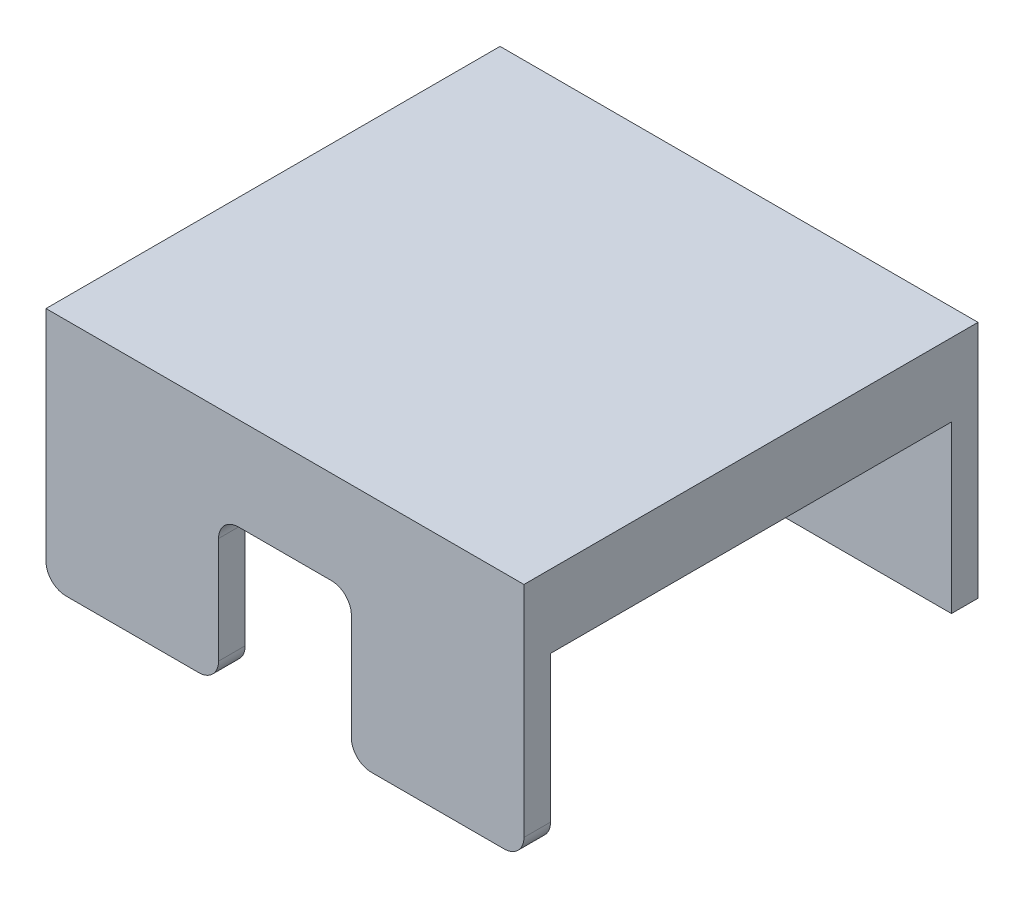
ISO-10303-21;
HEADER;
FILE_DESCRIPTION(('STEP AP214'),'2;1');
FILE_NAME('part.step','',(''),(''),'','','');
FILE_SCHEMA(('AUTOMOTIVE_DESIGN { 1 0 10303 214 1 1 1 1 }'));
ENDSEC;
DATA;
#1=APPLICATION_CONTEXT('core data for automotive mechanical design processes');
#2=APPLICATION_PROTOCOL_DEFINITION('international standard','automotive_design',2000,#1);
#3=PRODUCT_CONTEXT('',#1,'mechanical');
#4=PRODUCT('Part','Part','',(#3));
#5=PRODUCT_RELATED_PRODUCT_CATEGORY('part','',(#4));
#6=PRODUCT_DEFINITION_FORMATION('','',#4);
#7=PRODUCT_DEFINITION_CONTEXT('part definition',#1,'design');
#8=PRODUCT_DEFINITION('design','',#6,#7);
#9=PRODUCT_DEFINITION_SHAPE('','',#8);
#10=(LENGTH_UNIT() NAMED_UNIT(*) SI_UNIT(.MILLI.,.METRE.));
#11=(NAMED_UNIT(*) PLANE_ANGLE_UNIT() SI_UNIT($,.RADIAN.));
#12=(NAMED_UNIT(*) SI_UNIT($,.STERADIAN.) SOLID_ANGLE_UNIT());
#13=UNCERTAINTY_MEASURE_WITH_UNIT(LENGTH_MEASURE(1.E-05),#10,'distance_accuracy_value','');
#14=(GEOMETRIC_REPRESENTATION_CONTEXT(3) GLOBAL_UNCERTAINTY_ASSIGNED_CONTEXT((#13)) GLOBAL_UNIT_ASSIGNED_CONTEXT((#10,
#11,#12)) REPRESENTATION_CONTEXT('',''));
#15=CARTESIAN_POINT('',(0.,0.,0.));
#16=DIRECTION('',(0.,0.,1.));
#17=DIRECTION('',(1.,0.,0.));
#18=AXIS2_PLACEMENT_3D('',#15,#16,#17);
#19=CARTESIAN_POINT('',(0.,0.,0.));
#20=DIRECTION('',(0.,1.,0.));
#21=DIRECTION('',(0.,0.,1.));
#22=AXIS2_PLACEMENT_3D('',#19,#20,#21);
#23=PLANE('',#22);
#24=DIRECTION('',(1.,0.,0.));
#25=VECTOR('',#24,1.);
#26=CARTESIAN_POINT('',(0.,0.,-151.));
#27=LINE('',#26,#25);
#28=CARTESIAN_POINT('',(-180.,0.,-151.));
#29=VERTEX_POINT('',#28);
#30=CARTESIAN_POINT('',(180.,0.,-151.));
#31=VERTEX_POINT('',#30);
#32=EDGE_CURVE('E54',#29,#31,#27,.T.);
#33=ORIENTED_EDGE('',*,*,#32,.T.);
#34=DIRECTION('',(0.,0.,-1.));
#35=VECTOR('',#34,1.);
#36=CARTESIAN_POINT('',(180.,0.,-171.));
#37=LINE('',#36,#35);
#38=CARTESIAN_POINT('',(180.,0.,151.));
#39=VERTEX_POINT('',#38);
#40=EDGE_CURVE('E199',#39,#31,#37,.T.);
#41=ORIENTED_EDGE('',*,*,#40,.F.);
#42=DIRECTION('',(1.,0.,0.));
#43=VECTOR('',#42,1.);
#44=CARTESIAN_POINT('',(0.,0.,151.));
#45=LINE('',#44,#43);
#46=CARTESIAN_POINT('',(-180.,0.,151.));
#47=VERTEX_POINT('',#46);
#48=EDGE_CURVE('E324',#47,#39,#45,.T.);
#49=ORIENTED_EDGE('',*,*,#48,.F.);
#50=DIRECTION('',(0.,0.,1.));
#51=VECTOR('',#50,1.);
#52=CARTESIAN_POINT('',(-180.,0.,-171.));
#53=LINE('',#52,#51);
#54=EDGE_CURVE('E201',#29,#47,#53,.T.);
#55=ORIENTED_EDGE('',*,*,#54,.F.);
#56=EDGE_LOOP('',(#33,#41,#49,#55));
#57=FACE_BOUND('',#56,.T.);
#58=ADVANCED_FACE('F39',(#57),#23,.F.);
#59=CARTESIAN_POINT('',(180.,55.,-171.));
#60=DIRECTION('',(-1.,0.,0.));
#61=DIRECTION('',(0.,0.,1.));
#62=AXIS2_PLACEMENT_3D('',#59,#60,#61);
#63=PLANE('',#62);
#64=DIRECTION('',(0.,-1.,0.));
#65=VECTOR('',#64,1.);
#66=CARTESIAN_POINT('',(180.,55.,171.));
#67=LINE('',#66,#65);
#68=CARTESIAN_POINT('',(180.,55.,171.));
#69=VERTEX_POINT('',#68);
#70=CARTESIAN_POINT('',(180.,-110.,171.));
#71=VERTEX_POINT('',#70);
#72=EDGE_CURVE('E218',#69,#71,#67,.T.);
#73=ORIENTED_EDGE('',*,*,#72,.T.);
#74=DIRECTION('',(0.,0.,1.));
#75=VECTOR('',#74,1.);
#76=CARTESIAN_POINT('',(180.,-110.,-171.));
#77=LINE('',#76,#75);
#78=CARTESIAN_POINT('',(180.,-110.,151.));
#79=VERTEX_POINT('',#78);
#80=EDGE_CURVE('E270',#71,#79,#77,.F.);
#81=ORIENTED_EDGE('',*,*,#80,.T.);
#82=DIRECTION('',(0.,-1.,0.));
#83=VECTOR('',#82,1.);
#84=CARTESIAN_POINT('',(180.,0.,151.));
#85=LINE('',#84,#83);
#86=EDGE_CURVE('E207',#39,#79,#85,.T.);
#87=ORIENTED_EDGE('',*,*,#86,.F.);
#88=ORIENTED_EDGE('',*,*,#40,.T.);
#89=DIRECTION('',(0.,-1.,0.));
#90=VECTOR('',#89,1.);
#91=CARTESIAN_POINT('',(180.,0.,-151.));
#92=LINE('',#91,#90);
#93=CARTESIAN_POINT('',(180.,-125.,-151.));
#94=VERTEX_POINT('',#93);
#95=EDGE_CURVE('E188',#31,#94,#92,.T.);
#96=ORIENTED_EDGE('',*,*,#95,.T.);
#97=DIRECTION('',(0.,0.,-1.));
#98=VECTOR('',#97,1.);
#99=CARTESIAN_POINT('',(180.,-125.,-151.));
#100=LINE('',#99,#98);
#101=CARTESIAN_POINT('',(180.,-125.,-171.));
#102=VERTEX_POINT('',#101);
#103=EDGE_CURVE('E339',#94,#102,#100,.T.);
#104=ORIENTED_EDGE('',*,*,#103,.T.);
#105=DIRECTION('',(0.,-1.,0.));
#106=VECTOR('',#105,1.);
#107=CARTESIAN_POINT('',(180.,55.,-171.));
#108=LINE('',#107,#106);
#109=CARTESIAN_POINT('',(180.,55.,-171.));
#110=VERTEX_POINT('',#109);
#111=EDGE_CURVE('E225',#110,#102,#108,.T.);
#112=ORIENTED_EDGE('',*,*,#111,.F.);
#113=DIRECTION('',(0.,0.,-1.));
#114=VECTOR('',#113,1.);
#115=CARTESIAN_POINT('',(180.,55.,-171.));
#116=LINE('',#115,#114);
#117=EDGE_CURVE('E210',#69,#110,#116,.T.);
#118=ORIENTED_EDGE('',*,*,#117,.F.);
#119=EDGE_LOOP('',(#73,#81,#87,#88,#96,#104,#112,#118));
#120=FACE_BOUND('',#119,.T.);
#121=ADVANCED_FACE('F205',(#120),#63,.F.);
#122=CARTESIAN_POINT('',(-180.,55.,-171.));
#123=DIRECTION('',(0.,0.,1.));
#124=DIRECTION('',(1.,0.,0.));
#125=AXIS2_PLACEMENT_3D('',#122,#123,#124);
#126=PLANE('',#125);
#127=ORIENTED_EDGE('',*,*,#111,.T.);
#128=DIRECTION('',(-1.,0.,0.));
#129=VECTOR('',#128,1.);
#130=CARTESIAN_POINT('',(0.,-125.,-171.));
#131=LINE('',#130,#129);
#132=CARTESIAN_POINT('',(50.,-125.,-171.));
#133=VERTEX_POINT('',#132);
#134=EDGE_CURVE('E345',#102,#133,#131,.T.);
#135=ORIENTED_EDGE('',*,*,#134,.T.);
#136=DIRECTION('',(0.,-1.,0.));
#137=VECTOR('',#136,1.);
#138=CARTESIAN_POINT('',(50.,0.,-171.));
#139=LINE('',#138,#137);
#140=CARTESIAN_POINT('',(50.,-15.,-171.));
#141=VERTEX_POINT('',#140);
#142=EDGE_CURVE('E399',#141,#133,#139,.T.);
#143=ORIENTED_EDGE('',*,*,#142,.F.);
#144=DIRECTION('',(-1.,0.,0.));
#145=VECTOR('',#144,1.);
#146=CARTESIAN_POINT('',(0.,-15.,-171.));
#147=LINE('',#146,#145);
#148=CARTESIAN_POINT('',(-50.,-15.,-171.));
#149=VERTEX_POINT('',#148);
#150=EDGE_CURVE('E396',#141,#149,#147,.T.);
#151=ORIENTED_EDGE('',*,*,#150,.T.);
#152=DIRECTION('',(0.,-1.,0.));
#153=VECTOR('',#152,1.);
#154=CARTESIAN_POINT('',(-50.,0.,-171.));
#155=LINE('',#154,#153);
#156=CARTESIAN_POINT('',(-50.,-125.,-171.));
#157=VERTEX_POINT('',#156);
#158=EDGE_CURVE('E394',#149,#157,#155,.T.);
#159=ORIENTED_EDGE('',*,*,#158,.T.);
#160=DIRECTION('',(1.,0.,0.));
#161=VECTOR('',#160,1.);
#162=CARTESIAN_POINT('',(0.,-125.,-171.));
#163=LINE('',#162,#161);
#164=CARTESIAN_POINT('',(-180.,-125.,-171.));
#165=VERTEX_POINT('',#164);
#166=EDGE_CURVE('E202',#165,#157,#163,.T.);
#167=ORIENTED_EDGE('',*,*,#166,.F.);
#168=DIRECTION('',(0.,-1.,0.));
#169=VECTOR('',#168,1.);
#170=CARTESIAN_POINT('',(-180.,55.,-171.));
#171=LINE('',#170,#169);
#172=CARTESIAN_POINT('',(-180.,55.,-171.));
#173=VERTEX_POINT('',#172);
#174=EDGE_CURVE('E223',#173,#165,#171,.T.);
#175=ORIENTED_EDGE('',*,*,#174,.F.);
#176=DIRECTION('',(-1.,0.,0.));
#177=VECTOR('',#176,1.);
#178=CARTESIAN_POINT('',(-180.,55.,-171.));
#179=LINE('',#178,#177);
#180=EDGE_CURVE('E327',#110,#173,#179,.T.);
#181=ORIENTED_EDGE('',*,*,#180,.F.);
#182=EDGE_LOOP('',(#127,#135,#143,#151,#159,#167,#175,#181));
#183=FACE_BOUND('',#182,.T.);
#184=ADVANCED_FACE('F343',(#183),#126,.F.);
#185=CARTESIAN_POINT('',(-180.,55.,-171.));
#186=DIRECTION('',(1.,0.,0.));
#187=DIRECTION('',(0.,0.,-1.));
#188=AXIS2_PLACEMENT_3D('',#185,#186,#187);
#189=PLANE('',#188);
#190=DIRECTION('',(0.,-1.,0.));
#191=VECTOR('',#190,1.);
#192=CARTESIAN_POINT('',(-180.,0.,151.));
#193=LINE('',#192,#191);
#194=CARTESIAN_POINT('',(-180.,-110.,151.));
#195=VERTEX_POINT('',#194);
#196=EDGE_CURVE('E366',#47,#195,#193,.T.);
#197=ORIENTED_EDGE('',*,*,#196,.T.);
#198=DIRECTION('',(0.,0.,1.));
#199=VECTOR('',#198,1.);
#200=CARTESIAN_POINT('',(-180.,-110.,171.));
#201=LINE('',#200,#199);
#202=CARTESIAN_POINT('',(-180.,-110.,171.));
#203=VERTEX_POINT('',#202);
#204=EDGE_CURVE('E242',#195,#203,#201,.T.);
#205=ORIENTED_EDGE('',*,*,#204,.T.);
#206=DIRECTION('',(0.,-1.,0.));
#207=VECTOR('',#206,1.);
#208=CARTESIAN_POINT('',(-180.,55.,171.));
#209=LINE('',#208,#207);
#210=CARTESIAN_POINT('',(-180.,55.,171.));
#211=VERTEX_POINT('',#210);
#212=EDGE_CURVE('E220',#211,#203,#209,.T.);
#213=ORIENTED_EDGE('',*,*,#212,.F.);
#214=DIRECTION('',(0.,0.,1.));
#215=VECTOR('',#214,1.);
#216=CARTESIAN_POINT('',(-180.,55.,-171.));
#217=LINE('',#216,#215);
#218=EDGE_CURVE('E328',#173,#211,#217,.T.);
#219=ORIENTED_EDGE('',*,*,#218,.F.);
#220=ORIENTED_EDGE('',*,*,#174,.T.);
#221=DIRECTION('',(0.,0.,-1.));
#222=VECTOR('',#221,1.);
#223=CARTESIAN_POINT('',(-180.,-125.,-151.));
#224=LINE('',#223,#222);
#225=CARTESIAN_POINT('',(-180.,-125.,-151.));
#226=VERTEX_POINT('',#225);
#227=EDGE_CURVE('E374',#226,#165,#224,.T.);
#228=ORIENTED_EDGE('',*,*,#227,.F.);
#229=DIRECTION('',(0.,-1.,0.));
#230=VECTOR('',#229,1.);
#231=CARTESIAN_POINT('',(-180.,0.,-151.));
#232=LINE('',#231,#230);
#233=EDGE_CURVE('E384',#29,#226,#232,.T.);
#234=ORIENTED_EDGE('',*,*,#233,.F.);
#235=ORIENTED_EDGE('',*,*,#54,.T.);
#236=EDGE_LOOP('',(#197,#205,#213,#219,#220,#228,#234,#235));
#237=FACE_BOUND('',#236,.T.);
#238=ADVANCED_FACE('F354',(#237),#189,.F.);
#239=CARTESIAN_POINT('',(-180.,55.,171.));
#240=DIRECTION('',(0.,0.,-1.));
#241=DIRECTION('',(-1.,0.,0.));
#242=AXIS2_PLACEMENT_3D('',#239,#240,#241);
#243=PLANE('',#242);
#244=ORIENTED_EDGE('',*,*,#212,.T.);
#245=CARTESIAN_POINT('',(-165.,-110.,171.));
#246=DIRECTION('',(0.,0.,-1.));
#247=DIRECTION('',(-1.,0.,0.));
#248=AXIS2_PLACEMENT_3D('',#245,#246,#247);
#249=CIRCLE('',#248,15.);
#250=CARTESIAN_POINT('',(-165.,-125.,171.));
#251=VERTEX_POINT('',#250);
#252=EDGE_CURVE('E251',#203,#251,#249,.F.);
#253=ORIENTED_EDGE('',*,*,#252,.T.);
#254=DIRECTION('',(1.,0.,0.));
#255=VECTOR('',#254,1.);
#256=CARTESIAN_POINT('',(0.,-125.,171.));
#257=LINE('',#256,#255);
#258=CARTESIAN_POINT('',(-65.,-125.,171.));
#259=VERTEX_POINT('',#258);
#260=EDGE_CURVE('E315',#251,#259,#257,.T.);
#261=ORIENTED_EDGE('',*,*,#260,.T.);
#262=CARTESIAN_POINT('',(-65.,-110.,171.));
#263=DIRECTION('',(0.,0.,-1.));
#264=DIRECTION('',(-1.,0.,0.));
#265=AXIS2_PLACEMENT_3D('',#262,#263,#264);
#266=CIRCLE('',#265,15.);
#267=CARTESIAN_POINT('',(-50.,-110.,171.));
#268=VERTEX_POINT('',#267);
#269=EDGE_CURVE('E245',#259,#268,#266,.F.);
#270=ORIENTED_EDGE('',*,*,#269,.T.);
#271=DIRECTION('',(0.,-1.,0.));
#272=VECTOR('',#271,1.);
#273=CARTESIAN_POINT('',(-50.,0.,171.));
#274=LINE('',#273,#272);
#275=CARTESIAN_POINT('',(-50.,-30.,171.));
#276=VERTEX_POINT('',#275);
#277=EDGE_CURVE('E318',#276,#268,#274,.T.);
#278=ORIENTED_EDGE('',*,*,#277,.F.);
#279=CARTESIAN_POINT('',(-35.,-30.,171.));
#280=DIRECTION('',(0.,0.,-1.));
#281=DIRECTION('',(-1.,0.,0.));
#282=AXIS2_PLACEMENT_3D('',#279,#280,#281);
#283=CIRCLE('',#282,15.);
#284=CARTESIAN_POINT('',(-35.,-15.,171.));
#285=VERTEX_POINT('',#284);
#286=EDGE_CURVE('E272',#276,#285,#283,.T.);
#287=ORIENTED_EDGE('',*,*,#286,.T.);
#288=DIRECTION('',(-1.,0.,0.));
#289=VECTOR('',#288,1.);
#290=CARTESIAN_POINT('',(0.,-15.,171.));
#291=LINE('',#290,#289);
#292=CARTESIAN_POINT('',(35.,-15.,171.));
#293=VERTEX_POINT('',#292);
#294=EDGE_CURVE('E282',#293,#285,#291,.T.);
#295=ORIENTED_EDGE('',*,*,#294,.F.);
#296=CARTESIAN_POINT('',(35.,-30.,171.));
#297=DIRECTION('',(0.,0.,-1.));
#298=DIRECTION('',(-1.,0.,0.));
#299=AXIS2_PLACEMENT_3D('',#296,#297,#298);
#300=CIRCLE('',#299,15.);
#301=CARTESIAN_POINT('',(50.,-30.,171.));
#302=VERTEX_POINT('',#301);
#303=EDGE_CURVE('E47',#293,#302,#300,.T.);
#304=ORIENTED_EDGE('',*,*,#303,.T.);
#305=DIRECTION('',(0.,-1.,0.));
#306=VECTOR('',#305,1.);
#307=CARTESIAN_POINT('',(50.,0.,171.));
#308=LINE('',#307,#306);
#309=CARTESIAN_POINT('',(50.,-110.,171.));
#310=VERTEX_POINT('',#309);
#311=EDGE_CURVE('E280',#302,#310,#308,.T.);
#312=ORIENTED_EDGE('',*,*,#311,.T.);
#313=CARTESIAN_POINT('',(65.,-110.,171.));
#314=DIRECTION('',(0.,0.,-1.));
#315=DIRECTION('',(-1.,0.,0.));
#316=AXIS2_PLACEMENT_3D('',#313,#314,#315);
#317=CIRCLE('',#316,15.);
#318=CARTESIAN_POINT('',(65.,-125.,171.));
#319=VERTEX_POINT('',#318);
#320=EDGE_CURVE('E247',#310,#319,#317,.F.);
#321=ORIENTED_EDGE('',*,*,#320,.T.);
#322=DIRECTION('',(-1.,0.,0.));
#323=VECTOR('',#322,1.);
#324=CARTESIAN_POINT('',(0.,-125.,171.));
#325=LINE('',#324,#323);
#326=CARTESIAN_POINT('',(165.,-125.,171.));
#327=VERTEX_POINT('',#326);
#328=EDGE_CURVE('E291',#327,#319,#325,.T.);
#329=ORIENTED_EDGE('',*,*,#328,.F.);
#330=CARTESIAN_POINT('',(165.,-110.,171.));
#331=DIRECTION('',(0.,0.,-1.));
#332=DIRECTION('',(-1.,0.,0.));
#333=AXIS2_PLACEMENT_3D('',#330,#331,#332);
#334=CIRCLE('',#333,15.);
#335=EDGE_CURVE('E249',#327,#71,#334,.F.);
#336=ORIENTED_EDGE('',*,*,#335,.T.);
#337=ORIENTED_EDGE('',*,*,#72,.F.);
#338=DIRECTION('',(1.,0.,0.));
#339=VECTOR('',#338,1.);
#340=CARTESIAN_POINT('',(-180.,55.,171.));
#341=LINE('',#340,#339);
#342=EDGE_CURVE('E215',#211,#69,#341,.T.);
#343=ORIENTED_EDGE('',*,*,#342,.F.);
#344=EDGE_LOOP('',(#244,#253,#261,#270,#278,#287,#295,#304,#312,#321,#329,#336,#337,#343));
#345=FACE_BOUND('',#344,.T.);
#346=ADVANCED_FACE('F279',(#345),#243,.F.);
#347=CARTESIAN_POINT('',(0.,55.,0.));
#348=DIRECTION('',(0.,1.,0.));
#349=DIRECTION('',(0.,0.,1.));
#350=AXIS2_PLACEMENT_3D('',#347,#348,#349);
#351=PLANE('',#350);
#352=ORIENTED_EDGE('',*,*,#117,.T.);
#353=ORIENTED_EDGE('',*,*,#180,.T.);
#354=ORIENTED_EDGE('',*,*,#218,.T.);
#355=ORIENTED_EDGE('',*,*,#342,.T.);
#356=EDGE_LOOP('',(#352,#353,#354,#355));
#357=FACE_BOUND('',#356,.T.);
#358=ADVANCED_FACE('F334',(#357),#351,.T.);
#359=CARTESIAN_POINT('',(0.,-125.,151.));
#360=DIRECTION('',(0.,1.,0.));
#361=DIRECTION('',(-1.,0.,0.));
#362=AXIS2_PLACEMENT_3D('',#359,#360,#361);
#363=PLANE('',#362);
#364=DIRECTION('',(-1.,0.,0.));
#365=VECTOR('',#364,1.);
#366=CARTESIAN_POINT('',(0.,-125.,151.));
#367=LINE('',#366,#365);
#368=CARTESIAN_POINT('',(165.,-125.,151.));
#369=VERTEX_POINT('',#368);
#370=CARTESIAN_POINT('',(65.,-125.,151.));
#371=VERTEX_POINT('',#370);
#372=EDGE_CURVE('E212',#369,#371,#367,.T.);
#373=ORIENTED_EDGE('',*,*,#372,.F.);
#374=DIRECTION('',(0.,0.,1.));
#375=VECTOR('',#374,1.);
#376=CARTESIAN_POINT('',(165.,-125.,151.));
#377=LINE('',#376,#375);
#378=EDGE_CURVE('E267',#369,#327,#377,.T.);
#379=ORIENTED_EDGE('',*,*,#378,.T.);
#380=ORIENTED_EDGE('',*,*,#328,.T.);
#381=DIRECTION('',(0.,0.,1.));
#382=VECTOR('',#381,1.);
#383=CARTESIAN_POINT('',(65.,-125.,151.));
#384=LINE('',#383,#382);
#385=EDGE_CURVE('E62',#319,#371,#384,.F.);
#386=ORIENTED_EDGE('',*,*,#385,.T.);
#387=EDGE_LOOP('',(#373,#379,#380,#386));
#388=FACE_BOUND('',#387,.T.);
#389=ADVANCED_FACE('F491',(#388),#363,.F.);
#390=CARTESIAN_POINT('',(50.,0.,151.));
#391=DIRECTION('',(-1.,0.,0.));
#392=DIRECTION('',(0.,0.,1.));
#393=AXIS2_PLACEMENT_3D('',#390,#391,#392);
#394=PLANE('',#393);
#395=ORIENTED_EDGE('',*,*,#311,.F.);
#396=DIRECTION('',(0.,0.,1.));
#397=VECTOR('',#396,1.);
#398=CARTESIAN_POINT('',(50.,-30.,151.));
#399=LINE('',#398,#397);
#400=CARTESIAN_POINT('',(50.,-30.,151.));
#401=VERTEX_POINT('',#400);
#402=EDGE_CURVE('E240',#302,#401,#399,.F.);
#403=ORIENTED_EDGE('',*,*,#402,.T.);
#404=DIRECTION('',(0.,-1.,0.));
#405=VECTOR('',#404,1.);
#406=CARTESIAN_POINT('',(50.,0.,151.));
#407=LINE('',#406,#405);
#408=CARTESIAN_POINT('',(50.,-110.,151.));
#409=VERTEX_POINT('',#408);
#410=EDGE_CURVE('E302',#401,#409,#407,.T.);
#411=ORIENTED_EDGE('',*,*,#410,.T.);
#412=DIRECTION('',(0.,0.,1.));
#413=VECTOR('',#412,1.);
#414=CARTESIAN_POINT('',(50.,-110.,171.));
#415=LINE('',#414,#413);
#416=EDGE_CURVE('E237',#409,#310,#415,.T.);
#417=ORIENTED_EDGE('',*,*,#416,.T.);
#418=EDGE_LOOP('',(#395,#403,#411,#417));
#419=FACE_BOUND('',#418,.T.);
#420=ADVANCED_FACE('F287',(#419),#394,.T.);
#421=CARTESIAN_POINT('',(0.,-15.,151.));
#422=DIRECTION('',(0.,1.,0.));
#423=DIRECTION('',(0.,0.,1.));
#424=AXIS2_PLACEMENT_3D('',#421,#422,#423);
#425=PLANE('',#424);
#426=ORIENTED_EDGE('',*,*,#294,.T.);
#427=DIRECTION('',(0.,0.,1.));
#428=VECTOR('',#427,1.);
#429=CARTESIAN_POINT('',(-35.,-15.,151.));
#430=LINE('',#429,#428);
#431=CARTESIAN_POINT('',(-35.,-15.,151.));
#432=VERTEX_POINT('',#431);
#433=EDGE_CURVE('E235',#285,#432,#430,.F.);
#434=ORIENTED_EDGE('',*,*,#433,.T.);
#435=DIRECTION('',(-1.,0.,0.));
#436=VECTOR('',#435,1.);
#437=CARTESIAN_POINT('',(0.,-15.,151.));
#438=LINE('',#437,#436);
#439=CARTESIAN_POINT('',(35.,-15.,151.));
#440=VERTEX_POINT('',#439);
#441=EDGE_CURVE('E300',#440,#432,#438,.T.);
#442=ORIENTED_EDGE('',*,*,#441,.F.);
#443=DIRECTION('',(0.,0.,1.));
#444=VECTOR('',#443,1.);
#445=CARTESIAN_POINT('',(35.,-15.,151.));
#446=LINE('',#445,#444);
#447=EDGE_CURVE('E232',#440,#293,#446,.T.);
#448=ORIENTED_EDGE('',*,*,#447,.T.);
#449=EDGE_LOOP('',(#426,#434,#442,#448));
#450=FACE_BOUND('',#449,.T.);
#451=ADVANCED_FACE('F304',(#450),#425,.F.);
#452=CARTESIAN_POINT('',(-50.,0.,151.));
#453=DIRECTION('',(-1.,0.,0.));
#454=DIRECTION('',(0.,0.,1.));
#455=AXIS2_PLACEMENT_3D('',#452,#453,#454);
#456=PLANE('',#455);
#457=DIRECTION('',(0.,-1.,0.));
#458=VECTOR('',#457,1.);
#459=CARTESIAN_POINT('',(-50.,0.,151.));
#460=LINE('',#459,#458);
#461=CARTESIAN_POINT('',(-50.,-30.,151.));
#462=VERTEX_POINT('',#461);
#463=CARTESIAN_POINT('',(-50.,-110.,151.));
#464=VERTEX_POINT('',#463);
#465=EDGE_CURVE('E306',#462,#464,#460,.T.);
#466=ORIENTED_EDGE('',*,*,#465,.F.);
#467=DIRECTION('',(0.,0.,1.));
#468=VECTOR('',#467,1.);
#469=CARTESIAN_POINT('',(-50.,-30.,171.));
#470=LINE('',#469,#468);
#471=EDGE_CURVE('E229',#462,#276,#470,.T.);
#472=ORIENTED_EDGE('',*,*,#471,.T.);
#473=ORIENTED_EDGE('',*,*,#277,.T.);
#474=DIRECTION('',(0.,0.,1.));
#475=VECTOR('',#474,1.);
#476=CARTESIAN_POINT('',(-50.,-110.,151.));
#477=LINE('',#476,#475);
#478=EDGE_CURVE('E227',#268,#464,#477,.F.);
#479=ORIENTED_EDGE('',*,*,#478,.T.);
#480=EDGE_LOOP('',(#466,#472,#473,#479));
#481=FACE_BOUND('',#480,.T.);
#482=ADVANCED_FACE('F504',(#481),#456,.F.);
#483=CARTESIAN_POINT('',(0.,-125.,151.));
#484=DIRECTION('',(0.,-1.,0.));
#485=DIRECTION('',(1.,0.,0.));
#486=AXIS2_PLACEMENT_3D('',#483,#484,#485);
#487=PLANE('',#486);
#488=ORIENTED_EDGE('',*,*,#260,.F.);
#489=DIRECTION('',(0.,0.,1.));
#490=VECTOR('',#489,1.);
#491=CARTESIAN_POINT('',(-165.,-125.,151.));
#492=LINE('',#491,#490);
#493=CARTESIAN_POINT('',(-165.,-125.,151.));
#494=VERTEX_POINT('',#493);
#495=EDGE_CURVE('E256',#251,#494,#492,.F.);
#496=ORIENTED_EDGE('',*,*,#495,.T.);
#497=DIRECTION('',(1.,0.,0.));
#498=VECTOR('',#497,1.);
#499=CARTESIAN_POINT('',(0.,-125.,151.));
#500=LINE('',#499,#498);
#501=CARTESIAN_POINT('',(-65.,-125.,151.));
#502=VERTEX_POINT('',#501);
#503=EDGE_CURVE('E310',#494,#502,#500,.T.);
#504=ORIENTED_EDGE('',*,*,#503,.T.);
#505=DIRECTION('',(0.,0.,1.));
#506=VECTOR('',#505,1.);
#507=CARTESIAN_POINT('',(-65.,-125.,171.));
#508=LINE('',#507,#506);
#509=EDGE_CURVE('E253',#502,#259,#508,.T.);
#510=ORIENTED_EDGE('',*,*,#509,.T.);
#511=EDGE_LOOP('',(#488,#496,#504,#510));
#512=FACE_BOUND('',#511,.T.);
#513=ADVANCED_FACE('F360',(#512),#487,.T.);
#514=CARTESIAN_POINT('',(0.,0.,151.));
#515=DIRECTION('',(0.,0.,1.));
#516=DIRECTION('',(1.,0.,0.));
#517=AXIS2_PLACEMENT_3D('',#514,#515,#516);
#518=PLANE('',#517);
#519=CARTESIAN_POINT('',(105.,-65.,151.));
#520=DIRECTION('',(0.,0.,1.));
#521=DIRECTION('',(1.,0.,0.));
#522=AXIS2_PLACEMENT_3D('',#519,#520,#521);
#523=CIRCLE('',#522,4.00000000000001);
#524=CARTESIAN_POINT('',(109.,-65.,151.));
#525=VERTEX_POINT('',#524);
#526=EDGE_CURVE('E377',#525,#525,#523,.T.);
#527=ORIENTED_EDGE('',*,*,#526,.T.);
#528=EDGE_LOOP('',(#527));
#529=FACE_BOUND('',#528,.T.);
#530=CARTESIAN_POINT('',(-105.,-65.,151.));
#531=DIRECTION('',(0.,0.,1.));
#532=DIRECTION('',(-1.,0.,0.));
#533=AXIS2_PLACEMENT_3D('',#530,#531,#532);
#534=CIRCLE('',#533,4.00000000000001);
#535=CARTESIAN_POINT('',(-109.,-65.,151.));
#536=VERTEX_POINT('',#535);
#537=EDGE_CURVE('E370',#536,#536,#534,.T.);
#538=ORIENTED_EDGE('',*,*,#537,.T.);
#539=EDGE_LOOP('',(#538));
#540=FACE_BOUND('',#539,.T.);
#541=ORIENTED_EDGE('',*,*,#503,.F.);
#542=CARTESIAN_POINT('',(-165.,-110.,151.));
#543=DIRECTION('',(0.,0.,1.));
#544=DIRECTION('',(1.,0.,0.));
#545=AXIS2_PLACEMENT_3D('',#542,#543,#544);
#546=CIRCLE('',#545,15.);
#547=EDGE_CURVE('E264',#494,#195,#546,.F.);
#548=ORIENTED_EDGE('',*,*,#547,.T.);
#549=ORIENTED_EDGE('',*,*,#196,.F.);
#550=ORIENTED_EDGE('',*,*,#48,.T.);
#551=ORIENTED_EDGE('',*,*,#86,.T.);
#552=CARTESIAN_POINT('',(165.,-110.,151.));
#553=DIRECTION('',(0.,0.,1.));
#554=DIRECTION('',(1.,0.,0.));
#555=AXIS2_PLACEMENT_3D('',#552,#553,#554);
#556=CIRCLE('',#555,15.);
#557=EDGE_CURVE('E262',#79,#369,#556,.F.);
#558=ORIENTED_EDGE('',*,*,#557,.T.);
#559=ORIENTED_EDGE('',*,*,#372,.T.);
#560=CARTESIAN_POINT('',(65.,-110.,151.));
#561=DIRECTION('',(0.,0.,1.));
#562=DIRECTION('',(1.,0.,0.));
#563=AXIS2_PLACEMENT_3D('',#560,#561,#562);
#564=CIRCLE('',#563,15.);
#565=EDGE_CURVE('E260',#371,#409,#564,.F.);
#566=ORIENTED_EDGE('',*,*,#565,.T.);
#567=ORIENTED_EDGE('',*,*,#410,.F.);
#568=CARTESIAN_POINT('',(35.,-30.,151.));
#569=DIRECTION('',(0.,0.,1.));
#570=DIRECTION('',(1.,0.,0.));
#571=AXIS2_PLACEMENT_3D('',#568,#569,#570);
#572=CIRCLE('',#571,15.);
#573=EDGE_CURVE('E11',#401,#440,#572,.T.);
#574=ORIENTED_EDGE('',*,*,#573,.T.);
#575=ORIENTED_EDGE('',*,*,#441,.T.);
#576=CARTESIAN_POINT('',(-35.,-30.,151.));
#577=DIRECTION('',(0.,0.,1.));
#578=DIRECTION('',(1.,0.,0.));
#579=AXIS2_PLACEMENT_3D('',#576,#577,#578);
#580=CIRCLE('',#579,15.);
#581=EDGE_CURVE('E274',#432,#462,#580,.T.);
#582=ORIENTED_EDGE('',*,*,#581,.T.);
#583=ORIENTED_EDGE('',*,*,#465,.T.);
#584=CARTESIAN_POINT('',(-65.,-110.,151.));
#585=DIRECTION('',(0.,0.,1.));
#586=DIRECTION('',(1.,0.,0.));
#587=AXIS2_PLACEMENT_3D('',#584,#585,#586);
#588=CIRCLE('',#587,15.);
#589=EDGE_CURVE('E258',#464,#502,#588,.F.);
#590=ORIENTED_EDGE('',*,*,#589,.T.);
#591=EDGE_LOOP('',(#541,#548,#549,#550,#551,#558,#559,#566,#567,#574,#575,#582,#583,#590));
#592=FACE_BOUND('',#591,.T.);
#593=ADVANCED_FACE('F299',(#529,#540,#592),#518,.F.);
#594=CARTESIAN_POINT('',(-105.,-65.,161.));
#595=DIRECTION('',(0.,0.,-1.));
#596=DIRECTION('',(-1.,0.,0.));
#597=AXIS2_PLACEMENT_3D('',#594,#595,#596);
#598=CYLINDRICAL_SURFACE('',#597,4.00000000000001);
#599=CARTESIAN_POINT('',(-105.,-65.,161.));
#600=DIRECTION('',(0.,0.,1.));
#601=DIRECTION('',(-1.,0.,0.));
#602=AXIS2_PLACEMENT_3D('',#599,#600,#601);
#603=CIRCLE('',#602,4.00000000000001);
#604=CARTESIAN_POINT('',(-109.,-65.,161.));
#605=VERTEX_POINT('',#604);
#606=EDGE_CURVE('E373',#605,#605,#603,.T.);
#607=ORIENTED_EDGE('',*,*,#606,.T.);
#608=EDGE_LOOP('',(#607));
#609=FACE_BOUND('',#608,.T.);
#610=ORIENTED_EDGE('',*,*,#537,.F.);
#611=EDGE_LOOP('',(#610));
#612=FACE_BOUND('',#611,.T.);
#613=ADVANCED_FACE('F511',(#609,#612),#598,.F.);
#614=CARTESIAN_POINT('',(-105.,-65.,161.));
#615=DIRECTION('',(0.,0.,-1.));
#616=DIRECTION('',(-1.,0.,0.));
#617=AXIS2_PLACEMENT_3D('',#614,#615,#616);
#618=PLANE('',#617);
#619=ORIENTED_EDGE('',*,*,#606,.F.);
#620=EDGE_LOOP('',(#619));
#621=FACE_BOUND('',#620,.T.);
#622=ADVANCED_FACE('F516',(#621),#618,.T.);
#623=CARTESIAN_POINT('',(105.,-65.,161.));
#624=DIRECTION('',(0.,0.,-1.));
#625=DIRECTION('',(-1.,0.,0.));
#626=AXIS2_PLACEMENT_3D('',#623,#624,#625);
#627=CYLINDRICAL_SURFACE('',#626,4.00000000000001);
#628=CARTESIAN_POINT('',(105.,-65.,161.));
#629=DIRECTION('',(0.,0.,1.));
#630=DIRECTION('',(1.,0.,0.));
#631=AXIS2_PLACEMENT_3D('',#628,#629,#630);
#632=CIRCLE('',#631,4.00000000000001);
#633=CARTESIAN_POINT('',(109.,-65.,161.));
#634=VERTEX_POINT('',#633);
#635=EDGE_CURVE('E319',#634,#634,#632,.T.);
#636=ORIENTED_EDGE('',*,*,#635,.T.);
#637=EDGE_LOOP('',(#636));
#638=FACE_BOUND('',#637,.T.);
#639=ORIENTED_EDGE('',*,*,#526,.F.);
#640=EDGE_LOOP('',(#639));
#641=FACE_BOUND('',#640,.T.);
#642=ADVANCED_FACE('F523',(#638,#641),#627,.F.);
#643=CARTESIAN_POINT('',(105.,-65.,161.));
#644=DIRECTION('',(0.,0.,1.));
#645=DIRECTION('',(1.,0.,0.));
#646=AXIS2_PLACEMENT_3D('',#643,#644,#645);
#647=PLANE('',#646);
#648=ORIENTED_EDGE('',*,*,#635,.F.);
#649=EDGE_LOOP('',(#648));
#650=FACE_BOUND('',#649,.T.);
#651=ADVANCED_FACE('F472',(#650),#647,.F.);
#652=CARTESIAN_POINT('',(-35.,-30.,151.));
#653=DIRECTION('',(0.,0.,-1.));
#654=DIRECTION('',(-1.,0.,0.));
#655=AXIS2_PLACEMENT_3D('',#652,#653,#654);
#656=CYLINDRICAL_SURFACE('',#655,15.);
#657=ORIENTED_EDGE('',*,*,#581,.F.);
#658=ORIENTED_EDGE('',*,*,#433,.F.);
#659=ORIENTED_EDGE('',*,*,#286,.F.);
#660=ORIENTED_EDGE('',*,*,#471,.F.);
#661=EDGE_LOOP('',(#657,#658,#659,#660));
#662=FACE_BOUND('',#661,.T.);
#663=ADVANCED_FACE('F469',(#662),#656,.F.);
#664=CARTESIAN_POINT('',(35.,-30.,151.));
#665=DIRECTION('',(0.,0.,1.));
#666=DIRECTION('',(1.,0.,0.));
#667=AXIS2_PLACEMENT_3D('',#664,#665,#666);
#668=CYLINDRICAL_SURFACE('',#667,15.);
#669=ORIENTED_EDGE('',*,*,#573,.F.);
#670=ORIENTED_EDGE('',*,*,#402,.F.);
#671=ORIENTED_EDGE('',*,*,#303,.F.);
#672=ORIENTED_EDGE('',*,*,#447,.F.);
#673=EDGE_LOOP('',(#669,#670,#671,#672));
#674=FACE_BOUND('',#673,.T.);
#675=ADVANCED_FACE('F294',(#674),#668,.F.);
#676=CARTESIAN_POINT('',(-165.,-110.,-171.));
#677=DIRECTION('',(0.,0.,-1.));
#678=DIRECTION('',(-1.,0.,0.));
#679=AXIS2_PLACEMENT_3D('',#676,#677,#678);
#680=CYLINDRICAL_SURFACE('',#679,15.);
#681=ORIENTED_EDGE('',*,*,#547,.F.);
#682=ORIENTED_EDGE('',*,*,#495,.F.);
#683=ORIENTED_EDGE('',*,*,#252,.F.);
#684=ORIENTED_EDGE('',*,*,#204,.F.);
#685=EDGE_LOOP('',(#681,#682,#683,#684));
#686=FACE_BOUND('',#685,.T.);
#687=ADVANCED_FACE('F364',(#686),#680,.T.);
#688=CARTESIAN_POINT('',(165.,-110.,151.));
#689=DIRECTION('',(0.,0.,1.));
#690=DIRECTION('',(1.,0.,0.));
#691=AXIS2_PLACEMENT_3D('',#688,#689,#690);
#692=CYLINDRICAL_SURFACE('',#691,15.);
#693=ORIENTED_EDGE('',*,*,#557,.F.);
#694=ORIENTED_EDGE('',*,*,#80,.F.);
#695=ORIENTED_EDGE('',*,*,#335,.F.);
#696=ORIENTED_EDGE('',*,*,#378,.F.);
#697=EDGE_LOOP('',(#693,#694,#695,#696));
#698=FACE_BOUND('',#697,.T.);
#699=ADVANCED_FACE('F478',(#698),#692,.T.);
#700=CARTESIAN_POINT('',(65.,-110.,151.));
#701=DIRECTION('',(0.,0.,-1.));
#702=DIRECTION('',(-1.,0.,0.));
#703=AXIS2_PLACEMENT_3D('',#700,#701,#702);
#704=CYLINDRICAL_SURFACE('',#703,15.);
#705=ORIENTED_EDGE('',*,*,#565,.F.);
#706=ORIENTED_EDGE('',*,*,#385,.F.);
#707=ORIENTED_EDGE('',*,*,#320,.F.);
#708=ORIENTED_EDGE('',*,*,#416,.F.);
#709=EDGE_LOOP('',(#705,#706,#707,#708));
#710=FACE_BOUND('',#709,.T.);
#711=ADVANCED_FACE('F480',(#710),#704,.T.);
#712=CARTESIAN_POINT('',(-65.,-110.,151.));
#713=DIRECTION('',(0.,0.,-1.));
#714=DIRECTION('',(-1.,0.,0.));
#715=AXIS2_PLACEMENT_3D('',#712,#713,#714);
#716=CYLINDRICAL_SURFACE('',#715,15.);
#717=ORIENTED_EDGE('',*,*,#589,.F.);
#718=ORIENTED_EDGE('',*,*,#478,.F.);
#719=ORIENTED_EDGE('',*,*,#269,.F.);
#720=ORIENTED_EDGE('',*,*,#509,.F.);
#721=EDGE_LOOP('',(#717,#718,#719,#720));
#722=FACE_BOUND('',#721,.T.);
#723=ADVANCED_FACE('F41',(#722),#716,.T.);
#724=CARTESIAN_POINT('',(0.,-125.,-151.));
#725=DIRECTION('',(0.,1.,0.));
#726=DIRECTION('',(-1.,0.,0.));
#727=AXIS2_PLACEMENT_3D('',#724,#725,#726);
#728=PLANE('',#727);
#729=ORIENTED_EDGE('',*,*,#166,.T.);
#730=DIRECTION('',(0.,0.,-1.));
#731=VECTOR('',#730,1.);
#732=CARTESIAN_POINT('',(-50.,-125.,-151.));
#733=LINE('',#732,#731);
#734=CARTESIAN_POINT('',(-50.,-125.,-151.));
#735=VERTEX_POINT('',#734);
#736=EDGE_CURVE('E390',#735,#157,#733,.T.);
#737=ORIENTED_EDGE('',*,*,#736,.F.);
#738=DIRECTION('',(1.,0.,0.));
#739=VECTOR('',#738,1.);
#740=CARTESIAN_POINT('',(0.,-125.,-151.));
#741=LINE('',#740,#739);
#742=EDGE_CURVE('E405',#226,#735,#741,.T.);
#743=ORIENTED_EDGE('',*,*,#742,.F.);
#744=ORIENTED_EDGE('',*,*,#227,.T.);
#745=EDGE_LOOP('',(#729,#737,#743,#744));
#746=FACE_BOUND('',#745,.T.);
#747=ADVANCED_FACE('F486',(#746),#728,.F.);
#748=CARTESIAN_POINT('',(-50.,0.,-151.));
#749=DIRECTION('',(1.,0.,0.));
#750=DIRECTION('',(0.,0.,-1.));
#751=AXIS2_PLACEMENT_3D('',#748,#749,#750);
#752=PLANE('',#751);
#753=ORIENTED_EDGE('',*,*,#158,.F.);
#754=DIRECTION('',(0.,0.,-1.));
#755=VECTOR('',#754,1.);
#756=CARTESIAN_POINT('',(-50.,-15.,-151.));
#757=LINE('',#756,#755);
#758=CARTESIAN_POINT('',(-50.,-15.,-151.));
#759=VERTEX_POINT('',#758);
#760=EDGE_CURVE('E388',#759,#149,#757,.T.);
#761=ORIENTED_EDGE('',*,*,#760,.F.);
#762=DIRECTION('',(0.,-1.,0.));
#763=VECTOR('',#762,1.);
#764=CARTESIAN_POINT('',(-50.,0.,-151.));
#765=LINE('',#764,#763);
#766=EDGE_CURVE('E407',#759,#735,#765,.T.);
#767=ORIENTED_EDGE('',*,*,#766,.T.);
#768=ORIENTED_EDGE('',*,*,#736,.T.);
#769=EDGE_LOOP('',(#753,#761,#767,#768));
#770=FACE_BOUND('',#769,.T.);
#771=ADVANCED_FACE('F546',(#770),#752,.T.);
#772=CARTESIAN_POINT('',(0.,-15.,-151.));
#773=DIRECTION('',(0.,-1.,0.));
#774=DIRECTION('',(0.,0.,-1.));
#775=AXIS2_PLACEMENT_3D('',#772,#773,#774);
#776=PLANE('',#775);
#777=ORIENTED_EDGE('',*,*,#150,.F.);
#778=DIRECTION('',(0.,0.,-1.));
#779=VECTOR('',#778,1.);
#780=CARTESIAN_POINT('',(50.,-15.,-151.));
#781=LINE('',#780,#779);
#782=CARTESIAN_POINT('',(50.,-15.,-151.));
#783=VERTEX_POINT('',#782);
#784=EDGE_CURVE('E386',#783,#141,#781,.T.);
#785=ORIENTED_EDGE('',*,*,#784,.F.);
#786=DIRECTION('',(-1.,0.,0.));
#787=VECTOR('',#786,1.);
#788=CARTESIAN_POINT('',(0.,-15.,-151.));
#789=LINE('',#788,#787);
#790=EDGE_CURVE('E410',#783,#759,#789,.T.);
#791=ORIENTED_EDGE('',*,*,#790,.T.);
#792=ORIENTED_EDGE('',*,*,#760,.T.);
#793=EDGE_LOOP('',(#777,#785,#791,#792));
#794=FACE_BOUND('',#793,.T.);
#795=ADVANCED_FACE('F542',(#794),#776,.T.);
#796=CARTESIAN_POINT('',(50.,0.,-151.));
#797=DIRECTION('',(1.,0.,0.));
#798=DIRECTION('',(0.,0.,-1.));
#799=AXIS2_PLACEMENT_3D('',#796,#797,#798);
#800=PLANE('',#799);
#801=ORIENTED_EDGE('',*,*,#142,.T.);
#802=DIRECTION('',(0.,0.,-1.));
#803=VECTOR('',#802,1.);
#804=CARTESIAN_POINT('',(50.,-125.,-151.));
#805=LINE('',#804,#803);
#806=CARTESIAN_POINT('',(50.,-125.,-151.));
#807=VERTEX_POINT('',#806);
#808=EDGE_CURVE('E383',#807,#133,#805,.T.);
#809=ORIENTED_EDGE('',*,*,#808,.F.);
#810=DIRECTION('',(0.,-1.,0.));
#811=VECTOR('',#810,1.);
#812=CARTESIAN_POINT('',(50.,0.,-151.));
#813=LINE('',#812,#811);
#814=EDGE_CURVE('E413',#783,#807,#813,.T.);
#815=ORIENTED_EDGE('',*,*,#814,.F.);
#816=ORIENTED_EDGE('',*,*,#784,.T.);
#817=EDGE_LOOP('',(#801,#809,#815,#816));
#818=FACE_BOUND('',#817,.T.);
#819=ADVANCED_FACE('F538',(#818),#800,.F.);
#820=CARTESIAN_POINT('',(0.,-125.,-151.));
#821=DIRECTION('',(0.,-1.,0.));
#822=DIRECTION('',(1.,0.,0.));
#823=AXIS2_PLACEMENT_3D('',#820,#821,#822);
#824=PLANE('',#823);
#825=ORIENTED_EDGE('',*,*,#134,.F.);
#826=ORIENTED_EDGE('',*,*,#103,.F.);
#827=DIRECTION('',(-1.,0.,0.));
#828=VECTOR('',#827,1.);
#829=CARTESIAN_POINT('',(0.,-125.,-151.));
#830=LINE('',#829,#828);
#831=EDGE_CURVE('E191',#94,#807,#830,.T.);
#832=ORIENTED_EDGE('',*,*,#831,.T.);
#833=ORIENTED_EDGE('',*,*,#808,.T.);
#834=EDGE_LOOP('',(#825,#826,#832,#833));
#835=FACE_BOUND('',#834,.T.);
#836=ADVANCED_FACE('F440',(#835),#824,.T.);
#837=CARTESIAN_POINT('',(0.,0.,-151.));
#838=DIRECTION('',(0.,0.,-1.));
#839=DIRECTION('',(1.,0.,0.));
#840=AXIS2_PLACEMENT_3D('',#837,#838,#839);
#841=PLANE('',#840);
#842=CARTESIAN_POINT('',(105.,-65.,-151.));
#843=DIRECTION('',(0.,0.,1.));
#844=DIRECTION('',(1.,0.,0.));
#845=AXIS2_PLACEMENT_3D('',#842,#843,#844);
#846=CIRCLE('',#845,4.00000000000001);
#847=CARTESIAN_POINT('',(109.,-65.,-151.));
#848=VERTEX_POINT('',#847);
#849=EDGE_CURVE('E422',#848,#848,#846,.T.);
#850=ORIENTED_EDGE('',*,*,#849,.F.);
#851=EDGE_LOOP('',(#850));
#852=FACE_BOUND('',#851,.T.);
#853=CARTESIAN_POINT('',(-105.,-65.,-151.));
#854=DIRECTION('',(0.,0.,1.));
#855=DIRECTION('',(-1.,0.,0.));
#856=AXIS2_PLACEMENT_3D('',#853,#854,#855);
#857=CIRCLE('',#856,4.00000000000001);
#858=CARTESIAN_POINT('',(-109.,-65.,-151.));
#859=VERTEX_POINT('',#858);
#860=EDGE_CURVE('E416',#859,#859,#857,.T.);
#861=ORIENTED_EDGE('',*,*,#860,.F.);
#862=EDGE_LOOP('',(#861));
#863=FACE_BOUND('',#862,.T.);
#864=ORIENTED_EDGE('',*,*,#32,.F.);
#865=ORIENTED_EDGE('',*,*,#233,.T.);
#866=ORIENTED_EDGE('',*,*,#742,.T.);
#867=ORIENTED_EDGE('',*,*,#766,.F.);
#868=ORIENTED_EDGE('',*,*,#790,.F.);
#869=ORIENTED_EDGE('',*,*,#814,.T.);
#870=ORIENTED_EDGE('',*,*,#831,.F.);
#871=ORIENTED_EDGE('',*,*,#95,.F.);
#872=EDGE_LOOP('',(#864,#865,#866,#867,#868,#869,#870,#871));
#873=FACE_BOUND('',#872,.T.);
#874=ADVANCED_FACE('F189',(#852,#863,#873),#841,.F.);
#875=CARTESIAN_POINT('',(-105.,-65.,-161.));
#876=DIRECTION('',(0.,0.,1.));
#877=DIRECTION('',(1.,0.,0.));
#878=AXIS2_PLACEMENT_3D('',#875,#876,#877);
#879=CYLINDRICAL_SURFACE('',#878,4.00000000000001);
#880=CARTESIAN_POINT('',(-105.,-65.,-161.));
#881=DIRECTION('',(0.,0.,1.));
#882=DIRECTION('',(-1.,0.,0.));
#883=AXIS2_PLACEMENT_3D('',#880,#881,#882);
#884=CIRCLE('',#883,4.00000000000001);
#885=CARTESIAN_POINT('',(-109.,-65.,-161.));
#886=VERTEX_POINT('',#885);
#887=EDGE_CURVE('E419',#886,#886,#884,.T.);
#888=ORIENTED_EDGE('',*,*,#887,.F.);
#889=EDGE_LOOP('',(#888));
#890=FACE_BOUND('',#889,.T.);
#891=ORIENTED_EDGE('',*,*,#860,.T.);
#892=EDGE_LOOP('',(#891));
#893=FACE_BOUND('',#892,.T.);
#894=ADVANCED_FACE('F439',(#890,#893),#879,.F.);
#895=CARTESIAN_POINT('',(-105.,-65.,-161.));
#896=DIRECTION('',(0.,0.,1.));
#897=DIRECTION('',(-1.,0.,0.));
#898=AXIS2_PLACEMENT_3D('',#895,#896,#897);
#899=PLANE('',#898);
#900=ORIENTED_EDGE('',*,*,#887,.T.);
#901=EDGE_LOOP('',(#900));
#902=FACE_BOUND('',#901,.T.);
#903=ADVANCED_FACE('F433',(#902),#899,.T.);
#904=CARTESIAN_POINT('',(105.,-65.,-161.));
#905=DIRECTION('',(0.,0.,1.));
#906=DIRECTION('',(1.,0.,0.));
#907=AXIS2_PLACEMENT_3D('',#904,#905,#906);
#908=CYLINDRICAL_SURFACE('',#907,4.00000000000001);
#909=CARTESIAN_POINT('',(105.,-65.,-161.));
#910=DIRECTION('',(0.,0.,1.));
#911=DIRECTION('',(1.,0.,0.));
#912=AXIS2_PLACEMENT_3D('',#909,#910,#911);
#913=CIRCLE('',#912,4.00000000000001);
#914=CARTESIAN_POINT('',(109.,-65.,-161.));
#915=VERTEX_POINT('',#914);
#916=EDGE_CURVE('E403',#915,#915,#913,.T.);
#917=ORIENTED_EDGE('',*,*,#916,.F.);
#918=EDGE_LOOP('',(#917));
#919=FACE_BOUND('',#918,.T.);
#920=ORIENTED_EDGE('',*,*,#849,.T.);
#921=EDGE_LOOP('',(#920));
#922=FACE_BOUND('',#921,.T.);
#923=ADVANCED_FACE('F430',(#919,#922),#908,.F.);
#924=CARTESIAN_POINT('',(105.,-65.,-161.));
#925=DIRECTION('',(0.,0.,-1.));
#926=DIRECTION('',(1.,0.,0.));
#927=AXIS2_PLACEMENT_3D('',#924,#925,#926);
#928=PLANE('',#927);
#929=ORIENTED_EDGE('',*,*,#916,.T.);
#930=EDGE_LOOP('',(#929));
#931=FACE_BOUND('',#930,.T.);
#932=ADVANCED_FACE('F428',(#931),#928,.F.);
#933=CLOSED_SHELL('',(#58,#121,#184,#238,#346,#358,#389,#420,#451,#482,#513,#593,#613,#622,#642,
#651,#663,#675,#687,#699,#711,#723,#747,#771,#795,#819,#836,#874,#894,#903,#923,#932));
#934=MANIFOLD_SOLID_BREP('B2',#933);
#935=ADVANCED_BREP_SHAPE_REPRESENTATION('',(#18,#934),#14);
#936=SHAPE_DEFINITION_REPRESENTATION(#9,#935);
ENDSEC;
END-ISO-10303-21;
